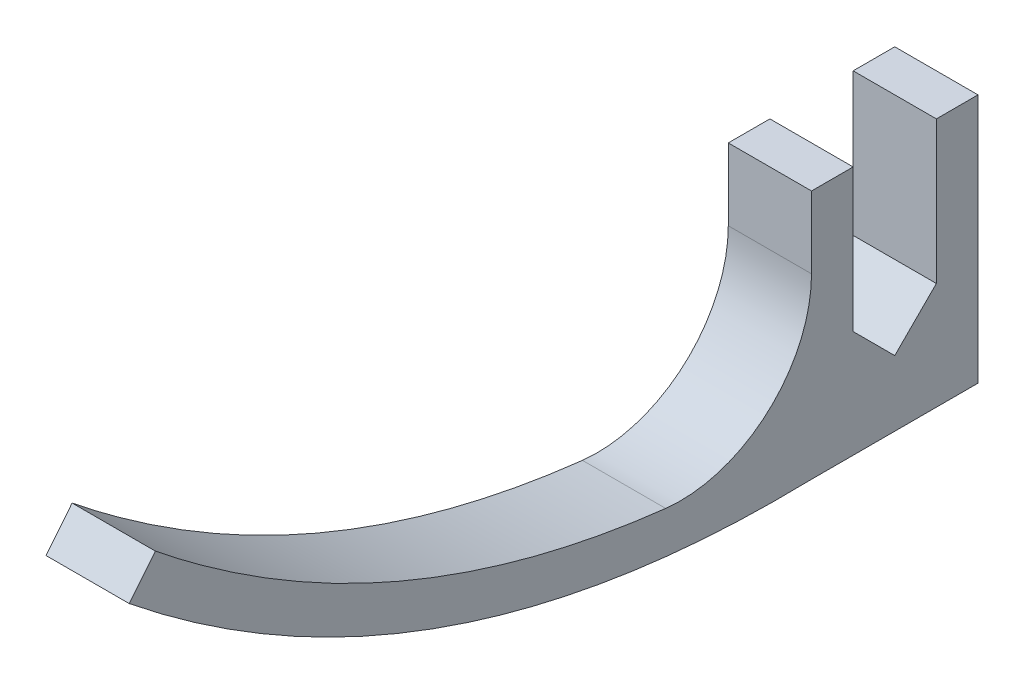
ISO-10303-21;
HEADER;
FILE_DESCRIPTION(('STEP AP214'),'2;1');
FILE_NAME('part.step','',(''),(''),'','','');
FILE_SCHEMA(('AUTOMOTIVE_DESIGN { 1 0 10303 214 1 1 1 1 }'));
ENDSEC;
DATA;
#1=APPLICATION_CONTEXT('core data for automotive mechanical design processes');
#2=APPLICATION_PROTOCOL_DEFINITION('international standard','automotive_design',2000,#1);
#3=PRODUCT_CONTEXT('',#1,'mechanical');
#4=PRODUCT('Part','Part','',(#3));
#5=PRODUCT_RELATED_PRODUCT_CATEGORY('part','',(#4));
#6=PRODUCT_DEFINITION_FORMATION('','',#4);
#7=PRODUCT_DEFINITION_CONTEXT('part definition',#1,'design');
#8=PRODUCT_DEFINITION('design','',#6,#7);
#9=PRODUCT_DEFINITION_SHAPE('','',#8);
#10=(LENGTH_UNIT() NAMED_UNIT(*) SI_UNIT(.MILLI.,.METRE.));
#11=(NAMED_UNIT(*) PLANE_ANGLE_UNIT() SI_UNIT($,.RADIAN.));
#12=(NAMED_UNIT(*) SI_UNIT($,.STERADIAN.) SOLID_ANGLE_UNIT());
#13=UNCERTAINTY_MEASURE_WITH_UNIT(LENGTH_MEASURE(1.E-05),#10,'distance_accuracy_value','');
#14=(GEOMETRIC_REPRESENTATION_CONTEXT(3) GLOBAL_UNCERTAINTY_ASSIGNED_CONTEXT((#13)) GLOBAL_UNIT_ASSIGNED_CONTEXT((#10,
#11,#12)) REPRESENTATION_CONTEXT('',''));
#15=CARTESIAN_POINT('',(0.,0.,0.));
#16=DIRECTION('',(0.,0.,1.));
#17=DIRECTION('',(1.,0.,0.));
#18=AXIS2_PLACEMENT_3D('',#15,#16,#17);
#19=CARTESIAN_POINT('',(12.7,0.,-72.8479628947369));
#20=DIRECTION('',(0.,0.,-1.));
#21=DIRECTION('',(-1.,0.,0.));
#22=AXIS2_PLACEMENT_3D('',#19,#20,#21);
#23=PLANE('',#22);
#24=DIRECTION('',(0.,-1.,0.));
#25=VECTOR('',#24,1.);
#26=CARTESIAN_POINT('',(0.,0.,-72.8479628947369));
#27=LINE('',#26,#25);
#28=CARTESIAN_POINT('',(0.,38.1,-72.8479628947369));
#29=VERTEX_POINT('',#28);
#30=CARTESIAN_POINT('',(0.,27.1526111686898,-72.8479628947369));
#31=VERTEX_POINT('',#30);
#32=EDGE_CURVE('E261',#29,#31,#27,.T.);
#33=ORIENTED_EDGE('',*,*,#32,.T.);
#34=DIRECTION('',(1.,0.,0.));
#35=VECTOR('',#34,1.);
#36=CARTESIAN_POINT('',(12.7,27.1526111686898,-72.8479628947369));
#37=LINE('',#36,#35);
#38=CARTESIAN_POINT('',(12.7,27.1526111686898,-72.8479628947369));
#39=VERTEX_POINT('',#38);
#40=EDGE_CURVE('E293',#31,#39,#37,.T.);
#41=ORIENTED_EDGE('',*,*,#40,.T.);
#42=DIRECTION('',(0.,-1.,0.));
#43=VECTOR('',#42,1.);
#44=CARTESIAN_POINT('',(12.7,0.,-72.8479628947369));
#45=LINE('',#44,#43);
#46=CARTESIAN_POINT('',(12.7,38.1,-72.8479628947369));
#47=VERTEX_POINT('',#46);
#48=EDGE_CURVE('E276',#47,#39,#45,.T.);
#49=ORIENTED_EDGE('',*,*,#48,.F.);
#50=DIRECTION('',(-1.,0.,0.));
#51=VECTOR('',#50,1.);
#52=CARTESIAN_POINT('',(12.7,38.1,-72.8479628947369));
#53=LINE('',#52,#51);
#54=EDGE_CURVE('E260',#47,#29,#53,.T.);
#55=ORIENTED_EDGE('',*,*,#54,.T.);
#56=EDGE_LOOP('',(#33,#41,#49,#55));
#57=FACE_BOUND('',#56,.T.);
#58=ADVANCED_FACE('F35',(#57),#23,.F.);
#59=CARTESIAN_POINT('',(12.7,0.,0.));
#60=DIRECTION('',(0.,1.,0.));
#61=DIRECTION('',(0.,0.,1.));
#62=AXIS2_PLACEMENT_3D('',#59,#60,#61);
#63=PLANE('',#62);
#64=DIRECTION('',(0.,0.,-1.));
#65=VECTOR('',#64,1.);
#66=CARTESIAN_POINT('',(0.,0.,0.));
#67=LINE('',#66,#65);
#68=CARTESIAN_POINT('',(0.,0.,-72.8479628947369));
#69=VERTEX_POINT('',#68);
#70=CARTESIAN_POINT('',(0.,0.,-98.2479628947368));
#71=VERTEX_POINT('',#70);
#72=EDGE_CURVE('E264',#69,#71,#67,.T.);
#73=ORIENTED_EDGE('',*,*,#72,.T.);
#74=DIRECTION('',(-1.,0.,0.));
#75=VECTOR('',#74,1.);
#76=CARTESIAN_POINT('',(12.7,0.,-98.2479628947368));
#77=LINE('',#76,#75);
#78=CARTESIAN_POINT('',(12.7,0.,-98.2479628947368));
#79=VERTEX_POINT('',#78);
#80=EDGE_CURVE('E287',#79,#71,#77,.T.);
#81=ORIENTED_EDGE('',*,*,#80,.F.);
#82=DIRECTION('',(0.,0.,-1.));
#83=VECTOR('',#82,1.);
#84=CARTESIAN_POINT('',(12.7,0.,0.));
#85=LINE('',#84,#83);
#86=CARTESIAN_POINT('',(12.7,0.,-72.8479628947369));
#87=VERTEX_POINT('',#86);
#88=EDGE_CURVE('E310',#87,#79,#85,.T.);
#89=ORIENTED_EDGE('',*,*,#88,.F.);
#90=DIRECTION('',(-1.,0.,0.));
#91=VECTOR('',#90,1.);
#92=CARTESIAN_POINT('',(12.7,0.,-72.8479628947369));
#93=LINE('',#92,#91);
#94=EDGE_CURVE('E290',#87,#69,#93,.T.);
#95=ORIENTED_EDGE('',*,*,#94,.T.);
#96=EDGE_LOOP('',(#73,#81,#89,#95));
#97=FACE_BOUND('',#96,.T.);
#98=ADVANCED_FACE('F214',(#97),#63,.F.);
#99=CARTESIAN_POINT('',(12.7,0.,-98.2479628947368));
#100=DIRECTION('',(0.,0.,1.));
#101=DIRECTION('',(1.,0.,0.));
#102=AXIS2_PLACEMENT_3D('',#99,#100,#101);
#103=PLANE('',#102);
#104=DIRECTION('',(0.,1.,0.));
#105=VECTOR('',#104,1.);
#106=CARTESIAN_POINT('',(0.,0.,-98.2479628947368));
#107=LINE('',#106,#105);
#108=CARTESIAN_POINT('',(0.,38.1,-98.2479628947368));
#109=VERTEX_POINT('',#108);
#110=EDGE_CURVE('E267',#71,#109,#107,.T.);
#111=ORIENTED_EDGE('',*,*,#110,.T.);
#112=DIRECTION('',(-1.,0.,0.));
#113=VECTOR('',#112,1.);
#114=CARTESIAN_POINT('',(12.7,38.1,-98.2479628947368));
#115=LINE('',#114,#113);
#116=CARTESIAN_POINT('',(12.7,38.1,-98.2479628947368));
#117=VERTEX_POINT('',#116);
#118=EDGE_CURVE('E284',#117,#109,#115,.T.);
#119=ORIENTED_EDGE('',*,*,#118,.F.);
#120=DIRECTION('',(0.,1.,0.));
#121=VECTOR('',#120,1.);
#122=CARTESIAN_POINT('',(12.7,0.,-98.2479628947368));
#123=LINE('',#122,#121);
#124=EDGE_CURVE('E255',#79,#117,#123,.T.);
#125=ORIENTED_EDGE('',*,*,#124,.F.);
#126=ORIENTED_EDGE('',*,*,#80,.T.);
#127=EDGE_LOOP('',(#111,#119,#125,#126));
#128=FACE_BOUND('',#127,.T.);
#129=ADVANCED_FACE('F210',(#128),#103,.F.);
#130=CARTESIAN_POINT('',(12.7,38.1,0.));
#131=DIRECTION('',(0.,-1.,0.));
#132=DIRECTION('',(0.,0.,-1.));
#133=AXIS2_PLACEMENT_3D('',#130,#131,#132);
#134=PLANE('',#133);
#135=DIRECTION('',(0.,0.,1.));
#136=VECTOR('',#135,1.);
#137=CARTESIAN_POINT('',(0.,38.1,0.));
#138=LINE('',#137,#136);
#139=CARTESIAN_POINT('',(0.,38.1,-91.8979628947368));
#140=VERTEX_POINT('',#139);
#141=EDGE_CURVE('E269',#109,#140,#138,.T.);
#142=ORIENTED_EDGE('',*,*,#141,.T.);
#143=DIRECTION('',(-1.,0.,0.));
#144=VECTOR('',#143,1.);
#145=CARTESIAN_POINT('',(12.7,38.1,-91.8979628947368));
#146=LINE('',#145,#144);
#147=CARTESIAN_POINT('',(12.7,38.1,-91.8979628947368));
#148=VERTEX_POINT('',#147);
#149=EDGE_CURVE('E282',#148,#140,#146,.T.);
#150=ORIENTED_EDGE('',*,*,#149,.F.);
#151=DIRECTION('',(0.,0.,1.));
#152=VECTOR('',#151,1.);
#153=CARTESIAN_POINT('',(12.7,38.1,0.));
#154=LINE('',#153,#152);
#155=EDGE_CURVE('E249',#117,#148,#154,.T.);
#156=ORIENTED_EDGE('',*,*,#155,.F.);
#157=ORIENTED_EDGE('',*,*,#118,.T.);
#158=EDGE_LOOP('',(#142,#150,#156,#157));
#159=FACE_BOUND('',#158,.T.);
#160=ADVANCED_FACE('F206',(#159),#134,.F.);
#161=CARTESIAN_POINT('',(12.7,0.,-91.8979628947368));
#162=DIRECTION('',(0.,0.,-1.));
#163=DIRECTION('',(-1.,0.,0.));
#164=AXIS2_PLACEMENT_3D('',#161,#162,#163);
#165=PLANE('',#164);
#166=DIRECTION('',(0.,-1.,0.));
#167=VECTOR('',#166,1.);
#168=CARTESIAN_POINT('',(0.,0.,-91.8979628947368));
#169=LINE('',#168,#167);
#170=CARTESIAN_POINT('',(0.,16.3499999999999,-91.8979628947368));
#171=VERTEX_POINT('',#170);
#172=EDGE_CURVE('E244',#140,#171,#169,.T.);
#173=ORIENTED_EDGE('',*,*,#172,.T.);
#174=DIRECTION('',(1.,0.,0.));
#175=VECTOR('',#174,1.);
#176=CARTESIAN_POINT('',(12.7,16.3499999999999,-91.8979628947368));
#177=LINE('',#176,#175);
#178=CARTESIAN_POINT('',(12.7,16.3499999999999,-91.8979628947368));
#179=VERTEX_POINT('',#178);
#180=EDGE_CURVE('E236',#171,#179,#177,.T.);
#181=ORIENTED_EDGE('',*,*,#180,.T.);
#182=DIRECTION('',(0.,-1.,0.));
#183=VECTOR('',#182,1.);
#184=CARTESIAN_POINT('',(12.7,0.,-91.8979628947368));
#185=LINE('',#184,#183);
#186=EDGE_CURVE('E242',#148,#179,#185,.T.);
#187=ORIENTED_EDGE('',*,*,#186,.F.);
#188=ORIENTED_EDGE('',*,*,#149,.T.);
#189=EDGE_LOOP('',(#173,#181,#187,#188));
#190=FACE_BOUND('',#189,.T.);
#191=ADVANCED_FACE('F202',(#190),#165,.F.);
#192=CARTESIAN_POINT('',(12.7,0.,-79.1979628947368));
#193=DIRECTION('',(0.,0.,1.));
#194=DIRECTION('',(0.,-1.,0.));
#195=AXIS2_PLACEMENT_3D('',#192,#193,#194);
#196=PLANE('',#195);
#197=DIRECTION('',(0.,1.,0.));
#198=VECTOR('',#197,1.);
#199=CARTESIAN_POINT('',(12.7,0.,-79.1979628947368));
#200=LINE('',#199,#198);
#201=CARTESIAN_POINT('',(12.7,16.3500000000001,-79.1979628947368));
#202=VERTEX_POINT('',#201);
#203=CARTESIAN_POINT('',(12.7,38.1,-79.1979628947368));
#204=VERTEX_POINT('',#203);
#205=EDGE_CURVE('E251',#202,#204,#200,.T.);
#206=ORIENTED_EDGE('',*,*,#205,.F.);
#207=DIRECTION('',(-1.,0.,0.));
#208=VECTOR('',#207,1.);
#209=CARTESIAN_POINT('',(0.,16.3500000000001,-79.1979628947368));
#210=LINE('',#209,#208);
#211=CARTESIAN_POINT('',(0.,16.3500000000001,-79.1979628947368));
#212=VERTEX_POINT('',#211);
#213=EDGE_CURVE('E245',#202,#212,#210,.T.);
#214=ORIENTED_EDGE('',*,*,#213,.T.);
#215=DIRECTION('',(0.,1.,0.));
#216=VECTOR('',#215,1.);
#217=CARTESIAN_POINT('',(0.,0.,-79.1979628947368));
#218=LINE('',#217,#216);
#219=CARTESIAN_POINT('',(0.,38.1,-79.1979628947368));
#220=VERTEX_POINT('',#219);
#221=EDGE_CURVE('E272',#212,#220,#218,.T.);
#222=ORIENTED_EDGE('',*,*,#221,.T.);
#223=DIRECTION('',(-1.,0.,0.));
#224=VECTOR('',#223,1.);
#225=CARTESIAN_POINT('',(12.7,38.1,-79.1979628947368));
#226=LINE('',#225,#224);
#227=EDGE_CURVE('E279',#204,#220,#226,.T.);
#228=ORIENTED_EDGE('',*,*,#227,.F.);
#229=EDGE_LOOP('',(#206,#214,#222,#228));
#230=FACE_BOUND('',#229,.T.);
#231=ADVANCED_FACE('F198',(#230),#196,.F.);
#232=CARTESIAN_POINT('',(12.7,38.1,0.));
#233=DIRECTION('',(0.,-1.,0.));
#234=DIRECTION('',(0.,0.,-1.));
#235=AXIS2_PLACEMENT_3D('',#232,#233,#234);
#236=PLANE('',#235);
#237=DIRECTION('',(0.,0.,1.));
#238=VECTOR('',#237,1.);
#239=CARTESIAN_POINT('',(0.,38.1,0.));
#240=LINE('',#239,#238);
#241=EDGE_CURVE('E274',#220,#29,#240,.T.);
#242=ORIENTED_EDGE('',*,*,#241,.T.);
#243=ORIENTED_EDGE('',*,*,#54,.F.);
#244=DIRECTION('',(0.,0.,1.));
#245=VECTOR('',#244,1.);
#246=CARTESIAN_POINT('',(12.7,38.1,0.));
#247=LINE('',#246,#245);
#248=EDGE_CURVE('E253',#204,#47,#247,.T.);
#249=ORIENTED_EDGE('',*,*,#248,.F.);
#250=ORIENTED_EDGE('',*,*,#227,.T.);
#251=EDGE_LOOP('',(#242,#243,#249,#250));
#252=FACE_BOUND('',#251,.T.);
#253=ADVANCED_FACE('F193',(#252),#236,.F.);
#254=CARTESIAN_POINT('',(12.7,0.,0.));
#255=DIRECTION('',(1.,0.,0.));
#256=DIRECTION('',(0.,0.,-1.));
#257=AXIS2_PLACEMENT_3D('',#254,#255,#256);
#258=PLANE('',#257);
#259=ORIENTED_EDGE('',*,*,#48,.T.);
#260=CARTESIAN_POINT('',(12.7,27.1526111686898,-52.8479628947369));
#261=DIRECTION('',(1.,0.,0.));
#262=DIRECTION('',(0.,0.,-1.));
#263=AXIS2_PLACEMENT_3D('',#260,#261,#262);
#264=CIRCLE('',#263,20.);
#265=CARTESIAN_POINT('',(12.7,7.27968692718056,-50.5969893073233));
#266=VERTEX_POINT('',#265);
#267=EDGE_CURVE('E143',#39,#266,#264,.F.);
#268=ORIENTED_EDGE('',*,*,#267,.T.);
#269=CARTESIAN_POINT('',(12.7,6.34904955410612,-72.2622482614912));
#270=CARTESIAN_POINT('',(12.7,6.12290117271,-63.0218832123235));
#271=CARTESIAN_POINT('',(12.7,6.66744561450977,-54.0289140358173));
#272=CARTESIAN_POINT('',(12.7,9.29109763159686,-36.5226944849123));
#273=CARTESIAN_POINT('',(12.7,11.3700864014079,-28.0091870172002));
#274=CARTESIAN_POINT('',(12.7,17.0649267373813,-11.4423787670961));
#275=CARTESIAN_POINT('',(12.7,20.680920682642,-3.38880336935423));
#276=CARTESIAN_POINT('',(12.7,29.4616446560838,12.2730029560284));
#277=CARTESIAN_POINT('',(12.7,34.6266265516634,19.8812726322155));
#278=CARTESIAN_POINT('',(12.7,40.5733192275621,27.2692620301631));
#279=B_SPLINE_CURVE_WITH_KNOTS('',3,(#269,#270,#271,#272,#273,#274,#275,#276,#277,#278),
.UNSPECIFIED.,.F.,.F.,(4,2,2,2,4),(0.,0.25,0.5,0.75,1.),.UNSPECIFIED.);
#280=CARTESIAN_POINT('',(12.7,40.5733192275621,27.2692620301631));
#281=VERTEX_POINT('',#280);
#282=EDGE_CURVE('E135',#266,#281,#279,.T.);
#283=ORIENTED_EDGE('',*,*,#282,.T.);
#284=DIRECTION('',(0.,0.778998181909319,-0.62702618173564));
#285=VECTOR('',#284,1.);
#286=CARTESIAN_POINT('',(12.7,35.6266807724379,31.2508782841844));
#287=LINE('',#286,#285);
#288=CARTESIAN_POINT('',(12.7,35.6266807724379,31.2508782841844));
#289=VERTEX_POINT('',#288);
#290=EDGE_CURVE('E141',#289,#281,#287,.T.);
#291=ORIENTED_EDGE('',*,*,#290,.F.);
#292=CARTESIAN_POINT('',(12.7,0.000950445893875204,-72.4176114241612));
#293=CARTESIAN_POINT('',(12.7,-0.233766761642234,-62.8271263295284));
#294=CARTESIAN_POINT('',(12.7,0.331247938192147,-53.463624564851));
#295=CARTESIAN_POINT('',(12.7,3.06756366550616,-35.2056606386222));
#296=CARTESIAN_POINT('',(12.7,5.23898349846201,-26.3114555703842));
#297=CARTESIAN_POINT('',(12.7,11.1858098291554,-9.01159715382173));
#298=CARTESIAN_POINT('',(12.7,14.9610739477943,-0.606218420846993));
#299=CARTESIAN_POINT('',(12.7,24.1037155632848,15.7011251099699));
#300=CARTESIAN_POINT('',(12.7,29.4708411927377,23.6030511592659));
#301=CARTESIAN_POINT('',(12.7,35.6266807724379,31.2508782841844));
#302=B_SPLINE_CURVE_WITH_KNOTS('',3,(#292,#293,#294,#295,#296,#297,#298,#299,#300,#301),
.UNSPECIFIED.,.F.,.F.,(4,2,2,2,4),(0.,0.25,0.5,0.75,1.),.UNSPECIFIED.);
#303=CARTESIAN_POINT('',(12.7,0.000950445893875204,-72.4176114241612));
#304=VERTEX_POINT('',#303);
#305=EDGE_CURVE('E160',#304,#289,#302,.T.);
#306=ORIENTED_EDGE('',*,*,#305,.F.);
#307=DIRECTION('',(0.,-0.00220852870480646,-0.999997561197506));
#308=VECTOR('',#307,1.);
#309=CARTESIAN_POINT('',(12.7,0.,-72.8479628947369));
#310=LINE('',#309,#308);
#311=EDGE_CURVE('E314',#304,#87,#310,.T.);
#312=ORIENTED_EDGE('',*,*,#311,.T.);
#313=ORIENTED_EDGE('',*,*,#88,.T.);
#314=ORIENTED_EDGE('',*,*,#124,.T.);
#315=ORIENTED_EDGE('',*,*,#155,.T.);
#316=ORIENTED_EDGE('',*,*,#186,.T.);
#317=DIRECTION('',(0.,0.707106781186543,-0.707106781186552));
#318=VECTOR('',#317,1.);
#319=CARTESIAN_POINT('',(12.7,6.35,-81.8979628947368));
#320=LINE('',#319,#318);
#321=CARTESIAN_POINT('',(12.7,10.,-85.5479628947368));
#322=VERTEX_POINT('',#321);
#323=EDGE_CURVE('E50',#179,#322,#320,.F.);
#324=ORIENTED_EDGE('',*,*,#323,.T.);
#325=DIRECTION('',(0.,-0.707106781186551,-0.707106781186544));
#326=VECTOR('',#325,1.);
#327=CARTESIAN_POINT('',(12.7,16.3500000000001,-79.1979628947368));
#328=LINE('',#327,#326);
#329=EDGE_CURVE('E11',#322,#202,#328,.F.);
#330=ORIENTED_EDGE('',*,*,#329,.T.);
#331=ORIENTED_EDGE('',*,*,#205,.T.);
#332=ORIENTED_EDGE('',*,*,#248,.T.);
#333=EDGE_LOOP('',(#259,#268,#283,#291,#306,#312,#313,#314,#315,#316,#324,#330,#331,#332));
#334=FACE_BOUND('',#333,.T.);
#335=ADVANCED_FACE('F138',(#334),#258,.T.);
#336=CARTESIAN_POINT('',(0.,0.,0.));
#337=DIRECTION('',(1.,0.,0.));
#338=DIRECTION('',(0.,0.,-1.));
#339=AXIS2_PLACEMENT_3D('',#336,#337,#338);
#340=PLANE('',#339);
#341=ORIENTED_EDGE('',*,*,#32,.F.);
#342=ORIENTED_EDGE('',*,*,#241,.F.);
#343=ORIENTED_EDGE('',*,*,#221,.F.);
#344=DIRECTION('',(0.,0.707106781186551,0.707106781186544));
#345=VECTOR('',#344,1.);
#346=CARTESIAN_POINT('',(0.,47.7739814473684,-47.7739814473688));
#347=LINE('',#346,#345);
#348=CARTESIAN_POINT('',(0.,10.,-85.5479628947368));
#349=VERTEX_POINT('',#348);
#350=EDGE_CURVE('E44',#212,#349,#347,.F.);
#351=ORIENTED_EDGE('',*,*,#350,.T.);
#352=DIRECTION('',(0.,-0.707106781186543,0.707106781186552));
#353=VECTOR('',#352,1.);
#354=CARTESIAN_POINT('',(0.,-37.7739814473683,-37.7739814473679));
#355=LINE('',#354,#353);
#356=EDGE_CURVE('E237',#349,#171,#355,.F.);
#357=ORIENTED_EDGE('',*,*,#356,.T.);
#358=ORIENTED_EDGE('',*,*,#172,.F.);
#359=ORIENTED_EDGE('',*,*,#141,.F.);
#360=ORIENTED_EDGE('',*,*,#110,.F.);
#361=ORIENTED_EDGE('',*,*,#72,.F.);
#362=DIRECTION('',(0.,-0.00220852870480646,-0.999997561197506));
#363=VECTOR('',#362,1.);
#364=CARTESIAN_POINT('',(0.,0.,-72.8479628947369));
#365=LINE('',#364,#363);
#366=CARTESIAN_POINT('',(0.,0.000950445893875204,-72.4176114241612));
#367=VERTEX_POINT('',#366);
#368=EDGE_CURVE('E312',#367,#69,#365,.T.);
#369=ORIENTED_EDGE('',*,*,#368,.F.);
#370=CARTESIAN_POINT('',(0.,0.000950445893875204,-72.4176114241612));
#371=CARTESIAN_POINT('',(0.,-0.233766761642234,-62.8271263295284));
#372=CARTESIAN_POINT('',(0.,0.331247938192147,-53.463624564851));
#373=CARTESIAN_POINT('',(0.,3.06756366550616,-35.2056606386222));
#374=CARTESIAN_POINT('',(0.,5.23898349846201,-26.3114555703842));
#375=CARTESIAN_POINT('',(0.,11.1858098291554,-9.01159715382173));
#376=CARTESIAN_POINT('',(0.,14.9610739477943,-0.606218420846993));
#377=CARTESIAN_POINT('',(0.,24.1037155632848,15.7011251099699));
#378=CARTESIAN_POINT('',(0.,29.4708411927377,23.6030511592659));
#379=CARTESIAN_POINT('',(0.,35.6266807724379,31.2508782841844));
#380=B_SPLINE_CURVE_WITH_KNOTS('',3,(#370,#371,#372,#373,#374,#375,#376,#377,#378,#379),
.UNSPECIFIED.,.F.,.F.,(4,2,2,2,4),(0.,0.25,0.5,0.75,1.),.UNSPECIFIED.);
#381=CARTESIAN_POINT('',(0.,35.6266807724379,31.2508782841844));
#382=VERTEX_POINT('',#381);
#383=EDGE_CURVE('E156',#367,#382,#380,.T.);
#384=ORIENTED_EDGE('',*,*,#383,.T.);
#385=DIRECTION('',(0.,0.778998181909319,-0.62702618173564));
#386=VECTOR('',#385,1.);
#387=CARTESIAN_POINT('',(0.,35.6266807724379,31.2508782841844));
#388=LINE('',#387,#386);
#389=CARTESIAN_POINT('',(0.,40.5733192275621,27.2692620301631));
#390=VERTEX_POINT('',#389);
#391=EDGE_CURVE('E175',#382,#390,#388,.T.);
#392=ORIENTED_EDGE('',*,*,#391,.T.);
#393=CARTESIAN_POINT('',(0.,6.34904955410612,-72.2622482614912));
#394=CARTESIAN_POINT('',(0.,6.12290117271,-63.0218832123235));
#395=CARTESIAN_POINT('',(0.,6.66744561450977,-54.0289140358173));
#396=CARTESIAN_POINT('',(0.,9.29109763159686,-36.5226944849123));
#397=CARTESIAN_POINT('',(0.,11.3700864014079,-28.0091870172002));
#398=CARTESIAN_POINT('',(0.,17.0649267373813,-11.4423787670961));
#399=CARTESIAN_POINT('',(0.,20.680920682642,-3.38880336935423));
#400=CARTESIAN_POINT('',(0.,29.4616446560838,12.2730029560284));
#401=CARTESIAN_POINT('',(0.,34.6266265516634,19.8812726322155));
#402=CARTESIAN_POINT('',(0.,40.5733192275621,27.2692620301631));
#403=B_SPLINE_CURVE_WITH_KNOTS('',3,(#393,#394,#395,#396,#397,#398,#399,#400,#401,#402),
.UNSPECIFIED.,.F.,.F.,(4,2,2,2,4),(0.,0.25,0.5,0.75,1.),.UNSPECIFIED.);
#404=CARTESIAN_POINT('',(0.,7.27968692718056,-50.5969893073233));
#405=VERTEX_POINT('',#404);
#406=EDGE_CURVE('E151',#405,#390,#403,.T.);
#407=ORIENTED_EDGE('',*,*,#406,.F.);
#408=CARTESIAN_POINT('',(0.,27.1526111686898,-52.8479628947369));
#409=DIRECTION('',(1.,0.,0.));
#410=DIRECTION('',(0.,0.,-1.));
#411=AXIS2_PLACEMENT_3D('',#408,#409,#410);
#412=CIRCLE('',#411,20.);
#413=EDGE_CURVE('E246',#405,#31,#412,.T.);
#414=ORIENTED_EDGE('',*,*,#413,.T.);
#415=EDGE_LOOP('',(#341,#342,#343,#351,#357,#358,#359,#360,#361,#369,#384,#392,#407,#414));
#416=FACE_BOUND('',#415,.T.);
#417=ADVANCED_FACE('F189',(#416),#340,.F.);
#418=CARTESIAN_POINT('',(0.,0.,-72.8479628947369));
#419=DIRECTION('',(0.,-0.999997561197506,0.00220852870480646));
#420=DIRECTION('',(0.,-0.00220852870480646,-0.999997561197506));
#421=AXIS2_PLACEMENT_3D('',#418,#419,#420);
#422=PLANE('',#421);
#423=ORIENTED_EDGE('',*,*,#311,.F.);
#424=DIRECTION('',(1.,0.,0.));
#425=VECTOR('',#424,1.);
#426=CARTESIAN_POINT('',(0.,0.000950445893875204,-72.4176114241612));
#427=LINE('',#426,#425);
#428=EDGE_CURVE('E265',#367,#304,#427,.T.);
#429=ORIENTED_EDGE('',*,*,#428,.F.);
#430=ORIENTED_EDGE('',*,*,#368,.T.);
#431=ORIENTED_EDGE('',*,*,#94,.F.);
#432=EDGE_LOOP('',(#423,#429,#430,#431));
#433=FACE_BOUND('',#432,.T.);
#434=ADVANCED_FACE('F185',(#433),#422,.T.);
#435=DIRECTION('',(1.,0.,0.));
#436=VECTOR('',#435,1.);
#437=SURFACE_OF_LINEAR_EXTRUSION('',#403,#436);
#438=ORIENTED_EDGE('',*,*,#282,.F.);
#439=DIRECTION('',(1.,0.,0.));
#440=VECTOR('',#439,1.);
#441=CARTESIAN_POINT('',(12.7,7.27968692718056,-50.5969893073233));
#442=LINE('',#441,#440);
#443=EDGE_CURVE('E296',#266,#405,#442,.F.);
#444=ORIENTED_EDGE('',*,*,#443,.T.);
#445=ORIENTED_EDGE('',*,*,#406,.T.);
#446=DIRECTION('',(1.,0.,0.));
#447=VECTOR('',#446,1.);
#448=CARTESIAN_POINT('',(0.,40.5733192275621,27.2692620301631));
#449=LINE('',#448,#447);
#450=EDGE_CURVE('E148',#390,#281,#449,.T.);
#451=ORIENTED_EDGE('',*,*,#450,.T.);
#452=EDGE_LOOP('',(#438,#444,#445,#451));
#453=FACE_BOUND('',#452,.T.);
#454=ADVANCED_FACE('F149',(#453),#437,.T.);
#455=DIRECTION('',(1.,0.,0.));
#456=VECTOR('',#455,1.);
#457=SURFACE_OF_LINEAR_EXTRUSION('',#380,#456);
#458=ORIENTED_EDGE('',*,*,#428,.T.);
#459=ORIENTED_EDGE('',*,*,#305,.T.);
#460=DIRECTION('',(1.,0.,0.));
#461=VECTOR('',#460,1.);
#462=CARTESIAN_POINT('',(0.,35.6266807724379,31.2508782841844));
#463=LINE('',#462,#461);
#464=EDGE_CURVE('E155',#382,#289,#463,.T.);
#465=ORIENTED_EDGE('',*,*,#464,.F.);
#466=ORIENTED_EDGE('',*,*,#383,.F.);
#467=EDGE_LOOP('',(#458,#459,#465,#466));
#468=FACE_BOUND('',#467,.T.);
#469=ADVANCED_FACE('F184',(#468),#457,.F.);
#470=CARTESIAN_POINT('',(0.,35.6266807724379,31.2508782841844));
#471=DIRECTION('',(0.,-0.627026181735639,-0.778998181909319));
#472=DIRECTION('',(0.,0.778998181909319,-0.627026181735639));
#473=AXIS2_PLACEMENT_3D('',#470,#471,#472);
#474=PLANE('',#473);
#475=ORIENTED_EDGE('',*,*,#464,.T.);
#476=ORIENTED_EDGE('',*,*,#290,.T.);
#477=ORIENTED_EDGE('',*,*,#450,.F.);
#478=ORIENTED_EDGE('',*,*,#391,.F.);
#479=EDGE_LOOP('',(#475,#476,#477,#478));
#480=FACE_BOUND('',#479,.T.);
#481=ADVANCED_FACE('F158',(#480),#474,.F.);
#482=CARTESIAN_POINT('',(6.35,27.1526111686898,-52.8479628947369));
#483=DIRECTION('',(1.,0.,0.));
#484=DIRECTION('',(0.,0.,-1.));
#485=AXIS2_PLACEMENT_3D('',#482,#483,#484);
#486=CYLINDRICAL_SURFACE('',#485,20.);
#487=ORIENTED_EDGE('',*,*,#413,.F.);
#488=ORIENTED_EDGE('',*,*,#443,.F.);
#489=ORIENTED_EDGE('',*,*,#267,.F.);
#490=ORIENTED_EDGE('',*,*,#40,.F.);
#491=EDGE_LOOP('',(#487,#488,#489,#490));
#492=FACE_BOUND('',#491,.T.);
#493=ADVANCED_FACE('F222',(#492),#486,.F.);
#494=CARTESIAN_POINT('',(12.7,16.3500000000001,-79.1979628947368));
#495=DIRECTION('',(0.,0.707106781186544,-0.707106781186551));
#496=DIRECTION('',(1.,0.,0.));
#497=AXIS2_PLACEMENT_3D('',#494,#495,#496);
#498=PLANE('',#497);
#499=ORIENTED_EDGE('',*,*,#213,.F.);
#500=ORIENTED_EDGE('',*,*,#329,.F.);
#501=DIRECTION('',(-1.,0.,0.));
#502=VECTOR('',#501,1.);
#503=CARTESIAN_POINT('',(12.7,10.,-85.5479628947368));
#504=LINE('',#503,#502);
#505=EDGE_CURVE('E39',#349,#322,#504,.F.);
#506=ORIENTED_EDGE('',*,*,#505,.F.);
#507=ORIENTED_EDGE('',*,*,#350,.F.);
#508=EDGE_LOOP('',(#499,#500,#506,#507));
#509=FACE_BOUND('',#508,.T.);
#510=ADVANCED_FACE('F37',(#509),#498,.T.);
#511=CARTESIAN_POINT('',(12.7,6.35,-81.8979628947368));
#512=DIRECTION('',(0.,0.707106781186552,0.707106781186543));
#513=DIRECTION('',(1.,0.,0.));
#514=AXIS2_PLACEMENT_3D('',#511,#512,#513);
#515=PLANE('',#514);
#516=ORIENTED_EDGE('',*,*,#323,.F.);
#517=ORIENTED_EDGE('',*,*,#180,.F.);
#518=ORIENTED_EDGE('',*,*,#356,.F.);
#519=ORIENTED_EDGE('',*,*,#505,.T.);
#520=EDGE_LOOP('',(#516,#517,#518,#519));
#521=FACE_BOUND('',#520,.T.);
#522=ADVANCED_FACE('F225',(#521),#515,.T.);
#523=CLOSED_SHELL('',(#58,#98,#129,#160,#191,#231,#253,#335,#417,#434,#454,#469,#481,#493,#510,#522));
#524=MANIFOLD_SOLID_BREP('B2',#523);
#525=ADVANCED_BREP_SHAPE_REPRESENTATION('',(#18,#524),#14);
#526=SHAPE_DEFINITION_REPRESENTATION(#9,#525);
ENDSEC;
END-ISO-10303-21;
